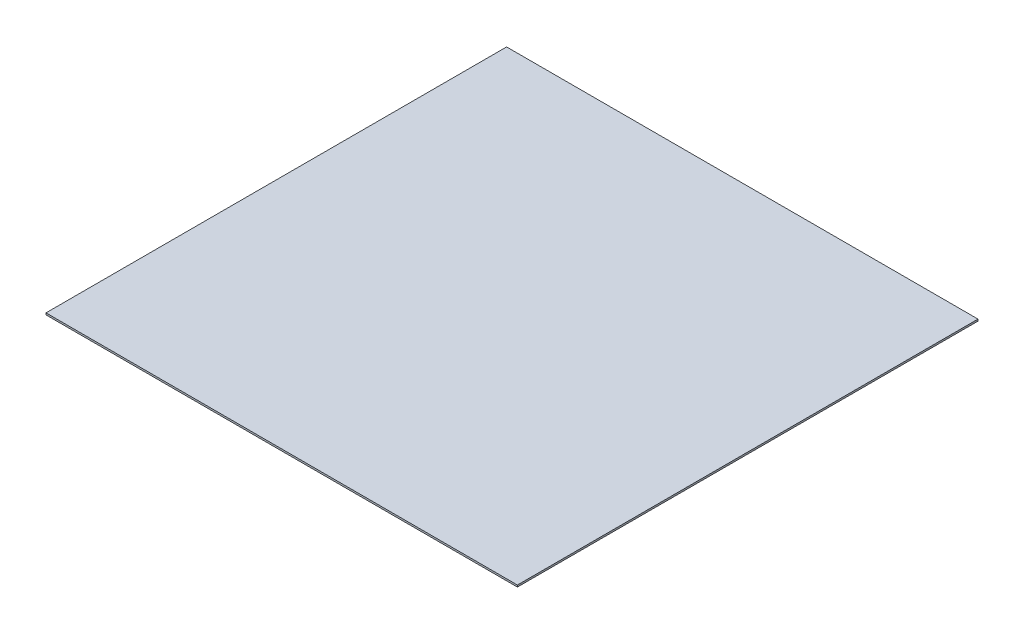
ISO-10303-21;
HEADER;
FILE_DESCRIPTION(('STEP AP214'),'2;1');
FILE_NAME('part.step','',(''),(''),'','','');
FILE_SCHEMA(('AUTOMOTIVE_DESIGN { 1 0 10303 214 1 1 1 1 }'));
ENDSEC;
DATA;
#1=APPLICATION_CONTEXT('core data for automotive mechanical design processes');
#2=APPLICATION_PROTOCOL_DEFINITION('international standard','automotive_design',2000,#1);
#3=PRODUCT_CONTEXT('',#1,'mechanical');
#4=PRODUCT('Part','Part','',(#3));
#5=PRODUCT_RELATED_PRODUCT_CATEGORY('part','',(#4));
#6=PRODUCT_DEFINITION_FORMATION('','',#4);
#7=PRODUCT_DEFINITION_CONTEXT('part definition',#1,'design');
#8=PRODUCT_DEFINITION('design','',#6,#7);
#9=PRODUCT_DEFINITION_SHAPE('','',#8);
#10=(LENGTH_UNIT() NAMED_UNIT(*) SI_UNIT(.MILLI.,.METRE.));
#11=(NAMED_UNIT(*) PLANE_ANGLE_UNIT() SI_UNIT($,.RADIAN.));
#12=(NAMED_UNIT(*) SI_UNIT($,.STERADIAN.) SOLID_ANGLE_UNIT());
#13=UNCERTAINTY_MEASURE_WITH_UNIT(LENGTH_MEASURE(1.E-05),#10,'distance_accuracy_value','');
#14=(GEOMETRIC_REPRESENTATION_CONTEXT(3) GLOBAL_UNCERTAINTY_ASSIGNED_CONTEXT((#13)) GLOBAL_UNIT_ASSIGNED_CONTEXT((#10,
#11,#12)) REPRESENTATION_CONTEXT('',''));
#15=CARTESIAN_POINT('',(0.,0.,0.));
#16=DIRECTION('',(0.,0.,1.));
#17=DIRECTION('',(1.,0.,0.));
#18=AXIS2_PLACEMENT_3D('',#15,#16,#17);
#19=CARTESIAN_POINT('',(0.,3.175,0.));
#20=DIRECTION('',(1.,0.,0.));
#21=DIRECTION('',(0.,0.,-1.));
#22=AXIS2_PLACEMENT_3D('',#19,#20,#21);
#23=PLANE('',#22);
#24=DIRECTION('',(0.,0.,1.));
#25=VECTOR('',#24,1.);
#26=CARTESIAN_POINT('',(0.,0.,0.));
#27=LINE('',#26,#25);
#28=CARTESIAN_POINT('',(0.,0.,-812.8));
#29=VERTEX_POINT('',#28);
#30=CARTESIAN_POINT('',(0.,0.,0.));
#31=VERTEX_POINT('',#30);
#32=EDGE_CURVE('E96',#29,#31,#27,.T.);
#33=ORIENTED_EDGE('',*,*,#32,.T.);
#34=DIRECTION('',(0.,-1.,0.));
#35=VECTOR('',#34,1.);
#36=CARTESIAN_POINT('',(0.,3.175,0.));
#37=LINE('',#36,#35);
#38=CARTESIAN_POINT('',(0.,3.175,0.));
#39=VERTEX_POINT('',#38);
#40=EDGE_CURVE('E11',#39,#31,#37,.T.);
#41=ORIENTED_EDGE('',*,*,#40,.F.);
#42=DIRECTION('',(0.,0.,1.));
#43=VECTOR('',#42,1.);
#44=CARTESIAN_POINT('',(0.,3.175,0.));
#45=LINE('',#44,#43);
#46=CARTESIAN_POINT('',(0.,3.175,-812.8));
#47=VERTEX_POINT('',#46);
#48=EDGE_CURVE('E84',#47,#39,#45,.T.);
#49=ORIENTED_EDGE('',*,*,#48,.F.);
#50=DIRECTION('',(0.,-1.,0.));
#51=VECTOR('',#50,1.);
#52=CARTESIAN_POINT('',(0.,3.175,-812.8));
#53=LINE('',#52,#51);
#54=EDGE_CURVE('E92',#47,#29,#53,.T.);
#55=ORIENTED_EDGE('',*,*,#54,.T.);
#56=EDGE_LOOP('',(#33,#41,#49,#55));
#57=FACE_BOUND('',#56,.T.);
#58=ADVANCED_FACE('F33',(#57),#23,.F.);
#59=CARTESIAN_POINT('',(0.,3.175,0.));
#60=DIRECTION('',(0.,0.,-1.));
#61=DIRECTION('',(-1.,0.,0.));
#62=AXIS2_PLACEMENT_3D('',#59,#60,#61);
#63=PLANE('',#62);
#64=DIRECTION('',(1.,0.,0.));
#65=VECTOR('',#64,1.);
#66=CARTESIAN_POINT('',(0.,0.,0.));
#67=LINE('',#66,#65);
#68=CARTESIAN_POINT('',(831.85,0.,0.));
#69=VERTEX_POINT('',#68);
#70=EDGE_CURVE('E88',#31,#69,#67,.T.);
#71=ORIENTED_EDGE('',*,*,#70,.T.);
#72=DIRECTION('',(0.,-1.,0.));
#73=VECTOR('',#72,1.);
#74=CARTESIAN_POINT('',(831.85,3.175,0.));
#75=LINE('',#74,#73);
#76=CARTESIAN_POINT('',(831.85,3.175,0.));
#77=VERTEX_POINT('',#76);
#78=EDGE_CURVE('E41',#77,#69,#75,.T.);
#79=ORIENTED_EDGE('',*,*,#78,.F.);
#80=DIRECTION('',(1.,0.,0.));
#81=VECTOR('',#80,1.);
#82=CARTESIAN_POINT('',(0.,3.175,0.));
#83=LINE('',#82,#81);
#84=EDGE_CURVE('E79',#39,#77,#83,.T.);
#85=ORIENTED_EDGE('',*,*,#84,.F.);
#86=ORIENTED_EDGE('',*,*,#40,.T.);
#87=EDGE_LOOP('',(#71,#79,#85,#86));
#88=FACE_BOUND('',#87,.T.);
#89=ADVANCED_FACE('F87',(#88),#63,.F.);
#90=CARTESIAN_POINT('',(831.85,3.175,0.));
#91=DIRECTION('',(-1.,0.,0.));
#92=DIRECTION('',(0.,0.,1.));
#93=AXIS2_PLACEMENT_3D('',#90,#91,#92);
#94=PLANE('',#93);
#95=DIRECTION('',(0.,0.,-1.));
#96=VECTOR('',#95,1.);
#97=CARTESIAN_POINT('',(831.85,0.,0.));
#98=LINE('',#97,#96);
#99=CARTESIAN_POINT('',(831.85,0.,-812.8));
#100=VERTEX_POINT('',#99);
#101=EDGE_CURVE('E66',#69,#100,#98,.T.);
#102=ORIENTED_EDGE('',*,*,#101,.T.);
#103=DIRECTION('',(0.,-1.,0.));
#104=VECTOR('',#103,1.);
#105=CARTESIAN_POINT('',(831.85,3.175,-812.8));
#106=LINE('',#105,#104);
#107=CARTESIAN_POINT('',(831.85,3.175,-812.8));
#108=VERTEX_POINT('',#107);
#109=EDGE_CURVE('E89',#108,#100,#106,.T.);
#110=ORIENTED_EDGE('',*,*,#109,.F.);
#111=DIRECTION('',(0.,0.,-1.));
#112=VECTOR('',#111,1.);
#113=CARTESIAN_POINT('',(831.85,3.175,0.));
#114=LINE('',#113,#112);
#115=EDGE_CURVE('E82',#77,#108,#114,.T.);
#116=ORIENTED_EDGE('',*,*,#115,.F.);
#117=ORIENTED_EDGE('',*,*,#78,.T.);
#118=EDGE_LOOP('',(#102,#110,#116,#117));
#119=FACE_BOUND('',#118,.T.);
#120=ADVANCED_FACE('F90',(#119),#94,.F.);
#121=CARTESIAN_POINT('',(0.,3.175,-812.8));
#122=DIRECTION('',(0.,0.,1.));
#123=DIRECTION('',(1.,0.,0.));
#124=AXIS2_PLACEMENT_3D('',#121,#122,#123);
#125=PLANE('',#124);
#126=DIRECTION('',(-1.,0.,0.));
#127=VECTOR('',#126,1.);
#128=CARTESIAN_POINT('',(0.,0.,-812.8));
#129=LINE('',#128,#127);
#130=EDGE_CURVE('E72',#100,#29,#129,.T.);
#131=ORIENTED_EDGE('',*,*,#130,.T.);
#132=ORIENTED_EDGE('',*,*,#54,.F.);
#133=DIRECTION('',(-1.,0.,0.));
#134=VECTOR('',#133,1.);
#135=CARTESIAN_POINT('',(0.,3.175,-812.8));
#136=LINE('',#135,#134);
#137=EDGE_CURVE('E49',#108,#47,#136,.T.);
#138=ORIENTED_EDGE('',*,*,#137,.F.);
#139=ORIENTED_EDGE('',*,*,#109,.T.);
#140=EDGE_LOOP('',(#131,#132,#138,#139));
#141=FACE_BOUND('',#140,.T.);
#142=ADVANCED_FACE('F103',(#141),#125,.F.);
#143=CARTESIAN_POINT('',(0.,3.175,0.));
#144=DIRECTION('',(0.,-1.,0.));
#145=DIRECTION('',(0.,0.,-1.));
#146=AXIS2_PLACEMENT_3D('',#143,#144,#145);
#147=PLANE('',#146);
#148=ORIENTED_EDGE('',*,*,#48,.T.);
#149=ORIENTED_EDGE('',*,*,#84,.T.);
#150=ORIENTED_EDGE('',*,*,#115,.T.);
#151=ORIENTED_EDGE('',*,*,#137,.T.);
#152=EDGE_LOOP('',(#148,#149,#150,#151));
#153=FACE_BOUND('',#152,.T.);
#154=ADVANCED_FACE('F80',(#153),#147,.F.);
#155=CARTESIAN_POINT('',(0.,0.,0.));
#156=DIRECTION('',(0.,-1.,0.));
#157=DIRECTION('',(0.,0.,-1.));
#158=AXIS2_PLACEMENT_3D('',#155,#156,#157);
#159=PLANE('',#158);
#160=ORIENTED_EDGE('',*,*,#32,.F.);
#161=ORIENTED_EDGE('',*,*,#130,.F.);
#162=ORIENTED_EDGE('',*,*,#101,.F.);
#163=ORIENTED_EDGE('',*,*,#70,.F.);
#164=EDGE_LOOP('',(#160,#161,#162,#163));
#165=FACE_BOUND('',#164,.T.);
#166=ADVANCED_FACE('F106',(#165),#159,.T.);
#167=CLOSED_SHELL('',(#58,#89,#120,#142,#154,#166));
#168=MANIFOLD_SOLID_BREP('B2',#167);
#169=ADVANCED_BREP_SHAPE_REPRESENTATION('',(#18,#168),#14);
#170=SHAPE_DEFINITION_REPRESENTATION(#9,#169);
ENDSEC;
END-ISO-10303-21;
